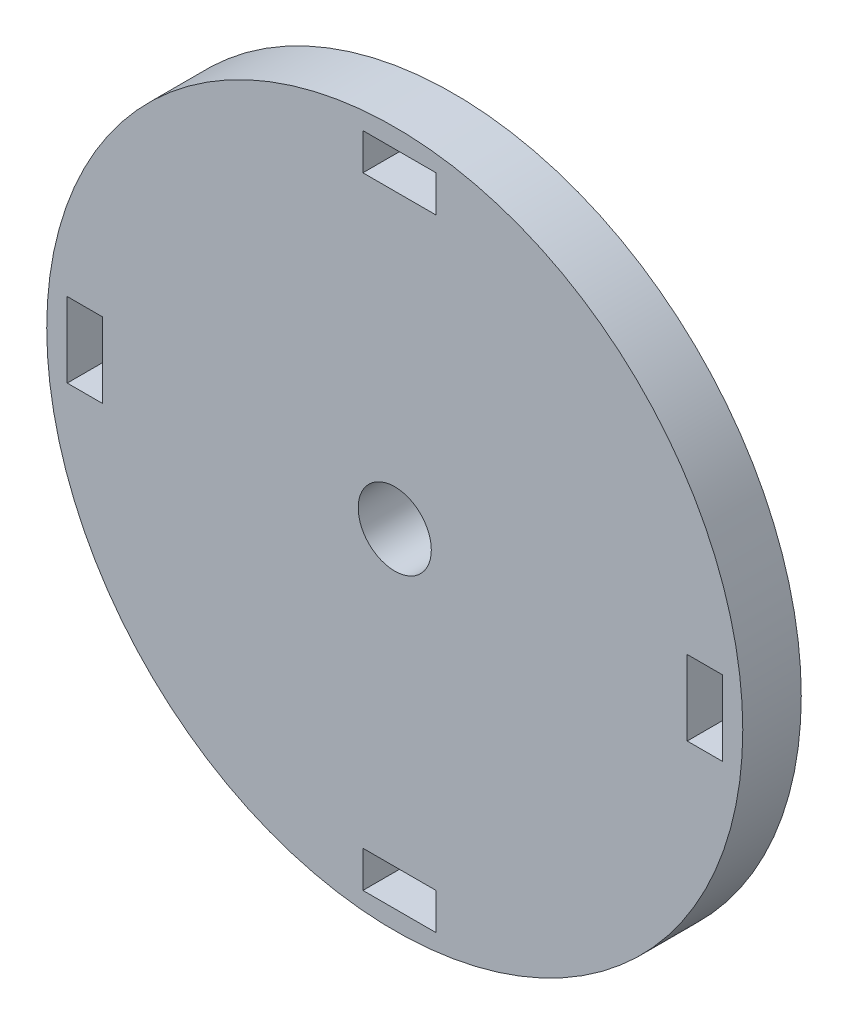
ISO-10303-21;
HEADER;
FILE_DESCRIPTION(('STEP AP214'),'2;1');
FILE_NAME('part.step','',(''),(''),'','','');
FILE_SCHEMA(('AUTOMOTIVE_DESIGN { 1 0 10303 214 1 1 1 1 }'));
ENDSEC;
DATA;
#1=APPLICATION_CONTEXT('core data for automotive mechanical design processes');
#2=APPLICATION_PROTOCOL_DEFINITION('international standard','automotive_design',2000,#1);
#3=PRODUCT_CONTEXT('',#1,'mechanical');
#4=PRODUCT('Part','Part','',(#3));
#5=PRODUCT_RELATED_PRODUCT_CATEGORY('part','',(#4));
#6=PRODUCT_DEFINITION_FORMATION('','',#4);
#7=PRODUCT_DEFINITION_CONTEXT('part definition',#1,'design');
#8=PRODUCT_DEFINITION('design','',#6,#7);
#9=PRODUCT_DEFINITION_SHAPE('','',#8);
#10=(LENGTH_UNIT() NAMED_UNIT(*) SI_UNIT(.MILLI.,.METRE.));
#11=(NAMED_UNIT(*) PLANE_ANGLE_UNIT() SI_UNIT($,.RADIAN.));
#12=(NAMED_UNIT(*) SI_UNIT($,.STERADIAN.) SOLID_ANGLE_UNIT());
#13=UNCERTAINTY_MEASURE_WITH_UNIT(LENGTH_MEASURE(1.E-05),#10,'distance_accuracy_value','');
#14=(GEOMETRIC_REPRESENTATION_CONTEXT(3) GLOBAL_UNCERTAINTY_ASSIGNED_CONTEXT((#13)) GLOBAL_UNIT_ASSIGNED_CONTEXT((#10,
#11,#12)) REPRESENTATION_CONTEXT('',''));
#15=CARTESIAN_POINT('',(0.,0.,0.));
#16=DIRECTION('',(0.,0.,1.));
#17=DIRECTION('',(1.,0.,0.));
#18=AXIS2_PLACEMENT_3D('',#15,#16,#17);
#19=CARTESIAN_POINT('',(0.,0.,2.));
#20=DIRECTION('',(0.,0.,-1.));
#21=DIRECTION('',(-1.,0.,0.));
#22=AXIS2_PLACEMENT_3D('',#19,#20,#21);
#23=CYLINDRICAL_SURFACE('',#22,11.9);
#24=CARTESIAN_POINT('',(0.,0.,2.));
#25=DIRECTION('',(0.,0.,1.));
#26=DIRECTION('',(1.,0.,0.));
#27=AXIS2_PLACEMENT_3D('',#24,#25,#26);
#28=CIRCLE('',#27,11.9);
#29=CARTESIAN_POINT('',(11.9,0.,2.));
#30=VERTEX_POINT('',#29);
#31=EDGE_CURVE('E11',#30,#30,#28,.T.);
#32=ORIENTED_EDGE('',*,*,#31,.F.);
#33=EDGE_LOOP('',(#32));
#34=FACE_BOUND('',#33,.T.);
#35=CARTESIAN_POINT('',(0.,0.,0.));
#36=DIRECTION('',(0.,0.,1.));
#37=DIRECTION('',(1.,0.,0.));
#38=AXIS2_PLACEMENT_3D('',#35,#36,#37);
#39=CIRCLE('',#38,11.9);
#40=CARTESIAN_POINT('',(11.9,0.,0.));
#41=VERTEX_POINT('',#40);
#42=EDGE_CURVE('E42',#41,#41,#39,.T.);
#43=ORIENTED_EDGE('',*,*,#42,.T.);
#44=EDGE_LOOP('',(#43));
#45=FACE_BOUND('',#44,.T.);
#46=ADVANCED_FACE('F39',(#34,#45),#23,.T.);
#47=CARTESIAN_POINT('',(0.,0.,2.));
#48=DIRECTION('',(0.,0.,1.));
#49=DIRECTION('',(1.,0.,0.));
#50=AXIS2_PLACEMENT_3D('',#47,#48,#49);
#51=PLANE('',#50);
#52=DIRECTION('',(0.,-1.,0.));
#53=VECTOR('',#52,1.);
#54=CARTESIAN_POINT('',(1.41141560235169,-10.,2.));
#55=LINE('',#54,#53);
#56=CARTESIAN_POINT('',(1.41141560235169,-10.,2.));
#57=VERTEX_POINT('',#56);
#58=CARTESIAN_POINT('',(1.41141560235169,-11.25,2.));
#59=VERTEX_POINT('',#58);
#60=EDGE_CURVE('E165',#57,#59,#55,.T.);
#61=ORIENTED_EDGE('',*,*,#60,.T.);
#62=DIRECTION('',(-1.,0.,0.));
#63=VECTOR('',#62,1.);
#64=CARTESIAN_POINT('',(-1.08858439764831,-11.25,2.));
#65=LINE('',#64,#63);
#66=CARTESIAN_POINT('',(-1.08858439764831,-11.25,2.));
#67=VERTEX_POINT('',#66);
#68=EDGE_CURVE('E151',#59,#67,#65,.T.);
#69=ORIENTED_EDGE('',*,*,#68,.T.);
#70=DIRECTION('',(0.,1.,0.));
#71=VECTOR('',#70,1.);
#72=CARTESIAN_POINT('',(-1.08858439764831,-10.,2.));
#73=LINE('',#72,#71);
#74=CARTESIAN_POINT('',(-1.08858439764831,-10.,2.));
#75=VERTEX_POINT('',#74);
#76=EDGE_CURVE('E182',#67,#75,#73,.T.);
#77=ORIENTED_EDGE('',*,*,#76,.T.);
#78=DIRECTION('',(1.,0.,0.));
#79=VECTOR('',#78,1.);
#80=CARTESIAN_POINT('',(-1.08858439764831,-10.,2.));
#81=LINE('',#80,#79);
#82=EDGE_CURVE('E175',#75,#57,#81,.T.);
#83=ORIENTED_EDGE('',*,*,#82,.T.);
#84=EDGE_LOOP('',(#61,#69,#77,#83));
#85=FACE_BOUND('',#84,.T.);
#86=DIRECTION('',(0.,1.,0.));
#87=VECTOR('',#86,1.);
#88=CARTESIAN_POINT('',(-1.08858439764831,10.,2.));
#89=LINE('',#88,#87);
#90=CARTESIAN_POINT('',(-1.08858439764831,10.,2.));
#91=VERTEX_POINT('',#90);
#92=CARTESIAN_POINT('',(-1.08858439764831,11.25,2.));
#93=VERTEX_POINT('',#92);
#94=EDGE_CURVE('E210',#91,#93,#89,.T.);
#95=ORIENTED_EDGE('',*,*,#94,.T.);
#96=DIRECTION('',(1.,0.,0.));
#97=VECTOR('',#96,1.);
#98=CARTESIAN_POINT('',(-1.08858439764831,11.25,2.));
#99=LINE('',#98,#97);
#100=CARTESIAN_POINT('',(1.41141560235169,11.25,2.));
#101=VERTEX_POINT('',#100);
#102=EDGE_CURVE('E232',#93,#101,#99,.T.);
#103=ORIENTED_EDGE('',*,*,#102,.T.);
#104=DIRECTION('',(0.,-1.,0.));
#105=VECTOR('',#104,1.);
#106=CARTESIAN_POINT('',(1.41141560235169,10.,2.));
#107=LINE('',#106,#105);
#108=CARTESIAN_POINT('',(1.41141560235169,10.,2.));
#109=VERTEX_POINT('',#108);
#110=EDGE_CURVE('E202',#101,#109,#107,.T.);
#111=ORIENTED_EDGE('',*,*,#110,.T.);
#112=DIRECTION('',(-1.,0.,0.));
#113=VECTOR('',#112,1.);
#114=CARTESIAN_POINT('',(-1.08858439764831,10.,2.));
#115=LINE('',#114,#113);
#116=EDGE_CURVE('E206',#109,#91,#115,.T.);
#117=ORIENTED_EDGE('',*,*,#116,.T.);
#118=EDGE_LOOP('',(#95,#103,#111,#117));
#119=FACE_BOUND('',#118,.T.);
#120=CARTESIAN_POINT('',(0.,0.,2.));
#121=DIRECTION('',(0.,0.,1.));
#122=DIRECTION('',(1.,0.,0.));
#123=AXIS2_PLACEMENT_3D('',#120,#121,#122);
#124=CIRCLE('',#123,1.25);
#125=CARTESIAN_POINT('',(1.25,0.,2.));
#126=VERTEX_POINT('',#125);
#127=EDGE_CURVE('E160',#126,#126,#124,.T.);
#128=ORIENTED_EDGE('',*,*,#127,.F.);
#129=EDGE_LOOP('',(#128));
#130=FACE_BOUND('',#129,.T.);
#131=DIRECTION('',(0.,1.,0.));
#132=VECTOR('',#131,1.);
#133=CARTESIAN_POINT('',(11.1985406210925,-1.28177260866835,2.));
#134=LINE('',#133,#132);
#135=CARTESIAN_POINT('',(11.1985406210925,-1.28177260866835,2.));
#136=VERTEX_POINT('',#135);
#137=CARTESIAN_POINT('',(11.1985406210925,1.28177260866835,2.));
#138=VERTEX_POINT('',#137);
#139=EDGE_CURVE('E264',#136,#138,#134,.T.);
#140=ORIENTED_EDGE('',*,*,#139,.F.);
#141=DIRECTION('',(1.,0.,0.));
#142=VECTOR('',#141,1.);
#143=CARTESIAN_POINT('',(10.,-1.28177260866835,2.));
#144=LINE('',#143,#142);
#145=CARTESIAN_POINT('',(10.,-1.28177260866835,2.));
#146=VERTEX_POINT('',#145);
#147=EDGE_CURVE('E275',#146,#136,#144,.T.);
#148=ORIENTED_EDGE('',*,*,#147,.F.);
#149=DIRECTION('',(0.,-1.,0.));
#150=VECTOR('',#149,1.);
#151=CARTESIAN_POINT('',(10.,-1.28177260866835,2.));
#152=LINE('',#151,#150);
#153=CARTESIAN_POINT('',(10.,1.28177260866835,2.));
#154=VERTEX_POINT('',#153);
#155=EDGE_CURVE('E271',#154,#146,#152,.T.);
#156=ORIENTED_EDGE('',*,*,#155,.F.);
#157=DIRECTION('',(-1.,0.,0.));
#158=VECTOR('',#157,1.);
#159=CARTESIAN_POINT('',(10.,1.28177260866835,2.));
#160=LINE('',#159,#158);
#161=EDGE_CURVE('E267',#138,#154,#160,.T.);
#162=ORIENTED_EDGE('',*,*,#161,.F.);
#163=EDGE_LOOP('',(#140,#148,#156,#162));
#164=FACE_BOUND('',#163,.T.);
#165=DIRECTION('',(0.,1.,0.));
#166=VECTOR('',#165,1.);
#167=CARTESIAN_POINT('',(-10.,-1.28177260866835,2.));
#168=LINE('',#167,#166);
#169=CARTESIAN_POINT('',(-10.,-1.28177260866835,2.));
#170=VERTEX_POINT('',#169);
#171=CARTESIAN_POINT('',(-10.,1.28177260866835,2.));
#172=VERTEX_POINT('',#171);
#173=EDGE_CURVE('E306',#170,#172,#168,.T.);
#174=ORIENTED_EDGE('',*,*,#173,.F.);
#175=DIRECTION('',(1.,0.,0.));
#176=VECTOR('',#175,1.);
#177=CARTESIAN_POINT('',(-10.,-1.28177260866835,2.));
#178=LINE('',#177,#176);
#179=CARTESIAN_POINT('',(-11.1985406210925,-1.28177260866835,2.));
#180=VERTEX_POINT('',#179);
#181=EDGE_CURVE('E317',#180,#170,#178,.T.);
#182=ORIENTED_EDGE('',*,*,#181,.F.);
#183=DIRECTION('',(0.,-1.,0.));
#184=VECTOR('',#183,1.);
#185=CARTESIAN_POINT('',(-11.1985406210925,-1.28177260866835,2.));
#186=LINE('',#185,#184);
#187=CARTESIAN_POINT('',(-11.1985406210925,1.28177260866835,2.));
#188=VERTEX_POINT('',#187);
#189=EDGE_CURVE('E313',#188,#180,#186,.T.);
#190=ORIENTED_EDGE('',*,*,#189,.F.);
#191=DIRECTION('',(-1.,0.,0.));
#192=VECTOR('',#191,1.);
#193=CARTESIAN_POINT('',(-10.,1.28177260866835,2.));
#194=LINE('',#193,#192);
#195=EDGE_CURVE('E309',#172,#188,#194,.T.);
#196=ORIENTED_EDGE('',*,*,#195,.F.);
#197=EDGE_LOOP('',(#174,#182,#190,#196));
#198=FACE_BOUND('',#197,.T.);
#199=ORIENTED_EDGE('',*,*,#31,.T.);
#200=EDGE_LOOP('',(#199));
#201=FACE_BOUND('',#200,.T.);
#202=ADVANCED_FACE('F173',(#85,#119,#130,#164,#198,#201),#51,.T.);
#203=CARTESIAN_POINT('',(0.,0.,0.));
#204=DIRECTION('',(0.,0.,1.));
#205=DIRECTION('',(1.,0.,0.));
#206=AXIS2_PLACEMENT_3D('',#203,#204,#205);
#207=PLANE('',#206);
#208=DIRECTION('',(-1.,0.,0.));
#209=VECTOR('',#208,1.);
#210=CARTESIAN_POINT('',(-1.08858439764831,-11.25,0.));
#211=LINE('',#210,#209);
#212=CARTESIAN_POINT('',(1.41141560235169,-11.25,0.));
#213=VERTEX_POINT('',#212);
#214=CARTESIAN_POINT('',(-1.08858439764831,-11.25,0.));
#215=VERTEX_POINT('',#214);
#216=EDGE_CURVE('E180',#213,#215,#211,.T.);
#217=ORIENTED_EDGE('',*,*,#216,.F.);
#218=DIRECTION('',(0.,-1.,0.));
#219=VECTOR('',#218,1.);
#220=CARTESIAN_POINT('',(1.41141560235169,-10.,0.));
#221=LINE('',#220,#219);
#222=CARTESIAN_POINT('',(1.41141560235169,-10.,0.));
#223=VERTEX_POINT('',#222);
#224=EDGE_CURVE('E168',#223,#213,#221,.T.);
#225=ORIENTED_EDGE('',*,*,#224,.F.);
#226=DIRECTION('',(1.,0.,0.));
#227=VECTOR('',#226,1.);
#228=CARTESIAN_POINT('',(-1.08858439764831,-10.,0.));
#229=LINE('',#228,#227);
#230=CARTESIAN_POINT('',(-1.08858439764831,-10.,0.));
#231=VERTEX_POINT('',#230);
#232=EDGE_CURVE('E170',#231,#223,#229,.T.);
#233=ORIENTED_EDGE('',*,*,#232,.F.);
#234=DIRECTION('',(0.,1.,0.));
#235=VECTOR('',#234,1.);
#236=CARTESIAN_POINT('',(-1.08858439764831,-10.,0.));
#237=LINE('',#236,#235);
#238=EDGE_CURVE('E188',#215,#231,#237,.T.);
#239=ORIENTED_EDGE('',*,*,#238,.F.);
#240=EDGE_LOOP('',(#217,#225,#233,#239));
#241=FACE_BOUND('',#240,.T.);
#242=DIRECTION('',(1.,0.,0.));
#243=VECTOR('',#242,1.);
#244=CARTESIAN_POINT('',(-1.08858439764831,11.25,0.));
#245=LINE('',#244,#243);
#246=CARTESIAN_POINT('',(-1.08858439764831,11.25,0.));
#247=VERTEX_POINT('',#246);
#248=CARTESIAN_POINT('',(1.41141560235169,11.25,0.));
#249=VERTEX_POINT('',#248);
#250=EDGE_CURVE('E217',#247,#249,#245,.T.);
#251=ORIENTED_EDGE('',*,*,#250,.F.);
#252=DIRECTION('',(0.,1.,0.));
#253=VECTOR('',#252,1.);
#254=CARTESIAN_POINT('',(-1.08858439764831,10.,0.));
#255=LINE('',#254,#253);
#256=CARTESIAN_POINT('',(-1.08858439764831,10.,0.));
#257=VERTEX_POINT('',#256);
#258=EDGE_CURVE('E214',#257,#247,#255,.T.);
#259=ORIENTED_EDGE('',*,*,#258,.F.);
#260=DIRECTION('',(-1.,0.,0.));
#261=VECTOR('',#260,1.);
#262=CARTESIAN_POINT('',(-1.08858439764831,10.,0.));
#263=LINE('',#262,#261);
#264=CARTESIAN_POINT('',(1.41141560235169,10.,0.));
#265=VERTEX_POINT('',#264);
#266=EDGE_CURVE('E224',#265,#257,#263,.T.);
#267=ORIENTED_EDGE('',*,*,#266,.F.);
#268=DIRECTION('',(0.,-1.,0.));
#269=VECTOR('',#268,1.);
#270=CARTESIAN_POINT('',(1.41141560235169,10.,0.));
#271=LINE('',#270,#269);
#272=EDGE_CURVE('E220',#249,#265,#271,.T.);
#273=ORIENTED_EDGE('',*,*,#272,.F.);
#274=EDGE_LOOP('',(#251,#259,#267,#273));
#275=FACE_BOUND('',#274,.T.);
#276=CARTESIAN_POINT('',(0.,0.,0.));
#277=DIRECTION('',(0.,0.,1.));
#278=DIRECTION('',(1.,0.,0.));
#279=AXIS2_PLACEMENT_3D('',#276,#277,#278);
#280=CIRCLE('',#279,1.25);
#281=CARTESIAN_POINT('',(1.25,0.,0.));
#282=VERTEX_POINT('',#281);
#283=EDGE_CURVE('E247',#282,#282,#280,.F.);
#284=ORIENTED_EDGE('',*,*,#283,.F.);
#285=EDGE_LOOP('',(#284));
#286=FACE_BOUND('',#285,.T.);
#287=DIRECTION('',(-1.,0.,0.));
#288=VECTOR('',#287,1.);
#289=CARTESIAN_POINT('',(10.,-1.28177260866835,0.));
#290=LINE('',#289,#288);
#291=CARTESIAN_POINT('',(11.1985406210925,-1.28177260866835,0.));
#292=VERTEX_POINT('',#291);
#293=CARTESIAN_POINT('',(10.,-1.28177260866835,0.));
#294=VERTEX_POINT('',#293);
#295=EDGE_CURVE('E255',#292,#294,#290,.T.);
#296=ORIENTED_EDGE('',*,*,#295,.F.);
#297=DIRECTION('',(0.,-1.,0.));
#298=VECTOR('',#297,1.);
#299=CARTESIAN_POINT('',(11.1985406210925,-1.28177260866835,0.));
#300=LINE('',#299,#298);
#301=CARTESIAN_POINT('',(11.1985406210925,1.28177260866835,0.));
#302=VERTEX_POINT('',#301);
#303=EDGE_CURVE('E260',#302,#292,#300,.T.);
#304=ORIENTED_EDGE('',*,*,#303,.F.);
#305=DIRECTION('',(1.,0.,0.));
#306=VECTOR('',#305,1.);
#307=CARTESIAN_POINT('',(10.,1.28177260866835,0.));
#308=LINE('',#307,#306);
#309=CARTESIAN_POINT('',(10.,1.28177260866835,0.));
#310=VERTEX_POINT('',#309);
#311=EDGE_CURVE('E283',#310,#302,#308,.T.);
#312=ORIENTED_EDGE('',*,*,#311,.F.);
#313=DIRECTION('',(0.,1.,0.));
#314=VECTOR('',#313,1.);
#315=CARTESIAN_POINT('',(10.,-1.28177260866835,0.));
#316=LINE('',#315,#314);
#317=EDGE_CURVE('E252',#294,#310,#316,.T.);
#318=ORIENTED_EDGE('',*,*,#317,.F.);
#319=EDGE_LOOP('',(#296,#304,#312,#318));
#320=FACE_BOUND('',#319,.T.);
#321=DIRECTION('',(-1.,0.,0.));
#322=VECTOR('',#321,1.);
#323=CARTESIAN_POINT('',(-10.,-1.28177260866835,0.));
#324=LINE('',#323,#322);
#325=CARTESIAN_POINT('',(-10.,-1.28177260866835,0.));
#326=VERTEX_POINT('',#325);
#327=CARTESIAN_POINT('',(-11.1985406210925,-1.28177260866835,0.));
#328=VERTEX_POINT('',#327);
#329=EDGE_CURVE('E298',#326,#328,#324,.T.);
#330=ORIENTED_EDGE('',*,*,#329,.F.);
#331=DIRECTION('',(0.,-1.,0.));
#332=VECTOR('',#331,1.);
#333=CARTESIAN_POINT('',(-10.,-1.28177260866835,0.));
#334=LINE('',#333,#332);
#335=CARTESIAN_POINT('',(-10.,1.28177260866835,0.));
#336=VERTEX_POINT('',#335);
#337=EDGE_CURVE('E302',#336,#326,#334,.T.);
#338=ORIENTED_EDGE('',*,*,#337,.F.);
#339=DIRECTION('',(1.,0.,0.));
#340=VECTOR('',#339,1.);
#341=CARTESIAN_POINT('',(-10.,1.28177260866835,0.));
#342=LINE('',#341,#340);
#343=CARTESIAN_POINT('',(-11.1985406210925,1.28177260866835,0.));
#344=VERTEX_POINT('',#343);
#345=EDGE_CURVE('E256',#344,#336,#342,.T.);
#346=ORIENTED_EDGE('',*,*,#345,.F.);
#347=DIRECTION('',(0.,1.,0.));
#348=VECTOR('',#347,1.);
#349=CARTESIAN_POINT('',(-11.1985406210925,-1.28177260866835,0.));
#350=LINE('',#349,#348);
#351=EDGE_CURVE('E251',#328,#344,#350,.T.);
#352=ORIENTED_EDGE('',*,*,#351,.F.);
#353=EDGE_LOOP('',(#330,#338,#346,#352));
#354=FACE_BOUND('',#353,.T.);
#355=ORIENTED_EDGE('',*,*,#42,.F.);
#356=EDGE_LOOP('',(#355));
#357=FACE_BOUND('',#356,.T.);
#358=ADVANCED_FACE('F345',(#241,#275,#286,#320,#354,#357),#207,.F.);
#359=CARTESIAN_POINT('',(-10.,-1.28177260866835,-0.00100000000000013));
#360=DIRECTION('',(1.,0.,0.));
#361=DIRECTION('',(0.,0.,-1.));
#362=AXIS2_PLACEMENT_3D('',#359,#360,#361);
#363=PLANE('',#362);
#364=ORIENTED_EDGE('',*,*,#337,.T.);
#365=DIRECTION('',(0.,0.,1.));
#366=VECTOR('',#365,1.);
#367=CARTESIAN_POINT('',(-10.,-1.28177260866835,-0.00100000000000013));
#368=LINE('',#367,#366);
#369=EDGE_CURVE('E322',#326,#170,#368,.T.);
#370=ORIENTED_EDGE('',*,*,#369,.T.);
#371=ORIENTED_EDGE('',*,*,#173,.T.);
#372=DIRECTION('',(0.,0.,1.));
#373=VECTOR('',#372,1.);
#374=CARTESIAN_POINT('',(-10.,1.28177260866835,-0.00100000000000013));
#375=LINE('',#374,#373);
#376=EDGE_CURVE('E321',#336,#172,#375,.T.);
#377=ORIENTED_EDGE('',*,*,#376,.F.);
#378=EDGE_LOOP('',(#364,#370,#371,#377));
#379=FACE_BOUND('',#378,.T.);
#380=ADVANCED_FACE('F348',(#379),#363,.F.);
#381=CARTESIAN_POINT('',(-10.,-1.28177260866835,-0.00100000000000013));
#382=DIRECTION('',(0.,-1.,0.));
#383=DIRECTION('',(0.,0.,-1.));
#384=AXIS2_PLACEMENT_3D('',#381,#382,#383);
#385=PLANE('',#384);
#386=ORIENTED_EDGE('',*,*,#329,.T.);
#387=DIRECTION('',(0.,0.,1.));
#388=VECTOR('',#387,1.);
#389=CARTESIAN_POINT('',(-11.1985406210925,-1.28177260866835,-0.00100000000000013));
#390=LINE('',#389,#388);
#391=EDGE_CURVE('E325',#328,#180,#390,.T.);
#392=ORIENTED_EDGE('',*,*,#391,.T.);
#393=ORIENTED_EDGE('',*,*,#181,.T.);
#394=ORIENTED_EDGE('',*,*,#369,.F.);
#395=EDGE_LOOP('',(#386,#392,#393,#394));
#396=FACE_BOUND('',#395,.T.);
#397=ADVANCED_FACE('F357',(#396),#385,.F.);
#398=CARTESIAN_POINT('',(-11.1985406210925,-1.28177260866835,-0.00100000000000013));
#399=DIRECTION('',(-1.,0.,0.));
#400=DIRECTION('',(0.,0.,1.));
#401=AXIS2_PLACEMENT_3D('',#398,#399,#400);
#402=PLANE('',#401);
#403=ORIENTED_EDGE('',*,*,#351,.T.);
#404=DIRECTION('',(0.,0.,1.));
#405=VECTOR('',#404,1.);
#406=CARTESIAN_POINT('',(-11.1985406210925,1.28177260866835,-0.00100000000000013));
#407=LINE('',#406,#405);
#408=EDGE_CURVE('E328',#344,#188,#407,.T.);
#409=ORIENTED_EDGE('',*,*,#408,.T.);
#410=ORIENTED_EDGE('',*,*,#189,.T.);
#411=ORIENTED_EDGE('',*,*,#391,.F.);
#412=EDGE_LOOP('',(#403,#409,#410,#411));
#413=FACE_BOUND('',#412,.T.);
#414=ADVANCED_FACE('F355',(#413),#402,.F.);
#415=CARTESIAN_POINT('',(-10.,1.28177260866835,-0.00100000000000013));
#416=DIRECTION('',(0.,1.,0.));
#417=DIRECTION('',(-1.,0.,0.));
#418=AXIS2_PLACEMENT_3D('',#415,#416,#417);
#419=PLANE('',#418);
#420=ORIENTED_EDGE('',*,*,#345,.T.);
#421=ORIENTED_EDGE('',*,*,#376,.T.);
#422=ORIENTED_EDGE('',*,*,#195,.T.);
#423=ORIENTED_EDGE('',*,*,#408,.F.);
#424=EDGE_LOOP('',(#420,#421,#422,#423));
#425=FACE_BOUND('',#424,.T.);
#426=ADVANCED_FACE('F340',(#425),#419,.F.);
#427=CARTESIAN_POINT('',(11.1985406210925,-1.28177260866835,-0.00100000000000013));
#428=DIRECTION('',(1.,0.,0.));
#429=DIRECTION('',(0.,0.,-1.));
#430=AXIS2_PLACEMENT_3D('',#427,#428,#429);
#431=PLANE('',#430);
#432=ORIENTED_EDGE('',*,*,#303,.T.);
#433=DIRECTION('',(0.,0.,1.));
#434=VECTOR('',#433,1.);
#435=CARTESIAN_POINT('',(11.1985406210925,-1.28177260866835,-0.00100000000000013));
#436=LINE('',#435,#434);
#437=EDGE_CURVE('E280',#292,#136,#436,.T.);
#438=ORIENTED_EDGE('',*,*,#437,.T.);
#439=ORIENTED_EDGE('',*,*,#139,.T.);
#440=DIRECTION('',(0.,0.,1.));
#441=VECTOR('',#440,1.);
#442=CARTESIAN_POINT('',(11.1985406210925,1.28177260866835,-0.00100000000000013));
#443=LINE('',#442,#441);
#444=EDGE_CURVE('E279',#302,#138,#443,.T.);
#445=ORIENTED_EDGE('',*,*,#444,.F.);
#446=EDGE_LOOP('',(#432,#438,#439,#445));
#447=FACE_BOUND('',#446,.T.);
#448=ADVANCED_FACE('F385',(#447),#431,.F.);
#449=CARTESIAN_POINT('',(10.,-1.28177260866835,-0.00100000000000013));
#450=DIRECTION('',(0.,-1.,0.));
#451=DIRECTION('',(0.,0.,-1.));
#452=AXIS2_PLACEMENT_3D('',#449,#450,#451);
#453=PLANE('',#452);
#454=ORIENTED_EDGE('',*,*,#295,.T.);
#455=DIRECTION('',(0.,0.,1.));
#456=VECTOR('',#455,1.);
#457=CARTESIAN_POINT('',(10.,-1.28177260866835,-0.00100000000000013));
#458=LINE('',#457,#456);
#459=EDGE_CURVE('E284',#294,#146,#458,.T.);
#460=ORIENTED_EDGE('',*,*,#459,.T.);
#461=ORIENTED_EDGE('',*,*,#147,.T.);
#462=ORIENTED_EDGE('',*,*,#437,.F.);
#463=EDGE_LOOP('',(#454,#460,#461,#462));
#464=FACE_BOUND('',#463,.T.);
#465=ADVANCED_FACE('F389',(#464),#453,.F.);
#466=CARTESIAN_POINT('',(10.,-1.28177260866835,-0.00100000000000013));
#467=DIRECTION('',(-1.,0.,0.));
#468=DIRECTION('',(0.,0.,1.));
#469=AXIS2_PLACEMENT_3D('',#466,#467,#468);
#470=PLANE('',#469);
#471=ORIENTED_EDGE('',*,*,#317,.T.);
#472=DIRECTION('',(0.,0.,1.));
#473=VECTOR('',#472,1.);
#474=CARTESIAN_POINT('',(10.,1.28177260866835,-0.00100000000000013));
#475=LINE('',#474,#473);
#476=EDGE_CURVE('E287',#310,#154,#475,.T.);
#477=ORIENTED_EDGE('',*,*,#476,.T.);
#478=ORIENTED_EDGE('',*,*,#155,.T.);
#479=ORIENTED_EDGE('',*,*,#459,.F.);
#480=EDGE_LOOP('',(#471,#477,#478,#479));
#481=FACE_BOUND('',#480,.T.);
#482=ADVANCED_FACE('F394',(#481),#470,.F.);
#483=CARTESIAN_POINT('',(10.,1.28177260866835,-0.00100000000000013));
#484=DIRECTION('',(0.,1.,0.));
#485=DIRECTION('',(-1.,0.,0.));
#486=AXIS2_PLACEMENT_3D('',#483,#484,#485);
#487=PLANE('',#486);
#488=ORIENTED_EDGE('',*,*,#311,.T.);
#489=ORIENTED_EDGE('',*,*,#444,.T.);
#490=ORIENTED_EDGE('',*,*,#161,.T.);
#491=ORIENTED_EDGE('',*,*,#476,.F.);
#492=EDGE_LOOP('',(#488,#489,#490,#491));
#493=FACE_BOUND('',#492,.T.);
#494=ADVANCED_FACE('F398',(#493),#487,.F.);
#495=CARTESIAN_POINT('',(0.,0.,-0.00100000000000013));
#496=DIRECTION('',(0.,0.,1.));
#497=DIRECTION('',(1.,0.,0.));
#498=AXIS2_PLACEMENT_3D('',#495,#496,#497);
#499=CYLINDRICAL_SURFACE('',#498,1.25);
#500=ORIENTED_EDGE('',*,*,#127,.T.);
#501=EDGE_LOOP('',(#500));
#502=FACE_BOUND('',#501,.T.);
#503=ORIENTED_EDGE('',*,*,#283,.T.);
#504=EDGE_LOOP('',(#503));
#505=FACE_BOUND('',#504,.T.);
#506=ADVANCED_FACE('F401',(#502,#505),#499,.F.);
#507=CARTESIAN_POINT('',(-1.08858439764831,10.,2.001));
#508=DIRECTION('',(-1.,0.,0.));
#509=DIRECTION('',(0.,-1.,0.));
#510=AXIS2_PLACEMENT_3D('',#507,#508,#509);
#511=PLANE('',#510);
#512=DIRECTION('',(0.,0.,-1.));
#513=VECTOR('',#512,1.);
#514=CARTESIAN_POINT('',(-1.08858439764831,10.,2.001));
#515=LINE('',#514,#513);
#516=EDGE_CURVE('E229',#91,#257,#515,.T.);
#517=ORIENTED_EDGE('',*,*,#516,.T.);
#518=ORIENTED_EDGE('',*,*,#258,.T.);
#519=DIRECTION('',(0.,0.,-1.));
#520=VECTOR('',#519,1.);
#521=CARTESIAN_POINT('',(-1.08858439764831,11.25,2.001));
#522=LINE('',#521,#520);
#523=EDGE_CURVE('E228',#93,#247,#522,.T.);
#524=ORIENTED_EDGE('',*,*,#523,.F.);
#525=ORIENTED_EDGE('',*,*,#94,.F.);
#526=EDGE_LOOP('',(#517,#518,#524,#525));
#527=FACE_BOUND('',#526,.T.);
#528=ADVANCED_FACE('F408',(#527),#511,.F.);
#529=CARTESIAN_POINT('',(-1.08858439764831,10.,2.001));
#530=DIRECTION('',(0.,-1.,0.));
#531=DIRECTION('',(0.,0.,-1.));
#532=AXIS2_PLACEMENT_3D('',#529,#530,#531);
#533=PLANE('',#532);
#534=DIRECTION('',(0.,0.,-1.));
#535=VECTOR('',#534,1.);
#536=CARTESIAN_POINT('',(1.41141560235169,10.,2.001));
#537=LINE('',#536,#535);
#538=EDGE_CURVE('E233',#109,#265,#537,.T.);
#539=ORIENTED_EDGE('',*,*,#538,.T.);
#540=ORIENTED_EDGE('',*,*,#266,.T.);
#541=ORIENTED_EDGE('',*,*,#516,.F.);
#542=ORIENTED_EDGE('',*,*,#116,.F.);
#543=EDGE_LOOP('',(#539,#540,#541,#542));
#544=FACE_BOUND('',#543,.T.);
#545=ADVANCED_FACE('F412',(#544),#533,.F.);
#546=CARTESIAN_POINT('',(1.41141560235169,10.,2.001));
#547=DIRECTION('',(1.,0.,0.));
#548=DIRECTION('',(0.,1.,0.));
#549=AXIS2_PLACEMENT_3D('',#546,#547,#548);
#550=PLANE('',#549);
#551=DIRECTION('',(0.,0.,-1.));
#552=VECTOR('',#551,1.);
#553=CARTESIAN_POINT('',(1.41141560235169,11.25,2.001));
#554=LINE('',#553,#552);
#555=EDGE_CURVE('E62',#101,#249,#554,.T.);
#556=ORIENTED_EDGE('',*,*,#555,.T.);
#557=ORIENTED_EDGE('',*,*,#272,.T.);
#558=ORIENTED_EDGE('',*,*,#538,.F.);
#559=ORIENTED_EDGE('',*,*,#110,.F.);
#560=EDGE_LOOP('',(#556,#557,#558,#559));
#561=FACE_BOUND('',#560,.T.);
#562=ADVANCED_FACE('F417',(#561),#550,.F.);
#563=CARTESIAN_POINT('',(-1.08858439764831,11.25,2.001));
#564=DIRECTION('',(0.,1.,0.));
#565=DIRECTION('',(0.,0.,1.));
#566=AXIS2_PLACEMENT_3D('',#563,#564,#565);
#567=PLANE('',#566);
#568=ORIENTED_EDGE('',*,*,#523,.T.);
#569=ORIENTED_EDGE('',*,*,#250,.T.);
#570=ORIENTED_EDGE('',*,*,#555,.F.);
#571=ORIENTED_EDGE('',*,*,#102,.F.);
#572=EDGE_LOOP('',(#568,#569,#570,#571));
#573=FACE_BOUND('',#572,.T.);
#574=ADVANCED_FACE('F414',(#573),#567,.F.);
#575=CARTESIAN_POINT('',(1.41141560235169,-10.,2.001));
#576=DIRECTION('',(1.,0.,0.));
#577=DIRECTION('',(0.,1.,0.));
#578=AXIS2_PLACEMENT_3D('',#575,#576,#577);
#579=PLANE('',#578);
#580=DIRECTION('',(0.,0.,-1.));
#581=VECTOR('',#580,1.);
#582=CARTESIAN_POINT('',(1.41141560235169,-10.,2.001));
#583=LINE('',#582,#581);
#584=EDGE_CURVE('E161',#57,#223,#583,.T.);
#585=ORIENTED_EDGE('',*,*,#584,.T.);
#586=ORIENTED_EDGE('',*,*,#224,.T.);
#587=DIRECTION('',(0.,0.,-1.));
#588=VECTOR('',#587,1.);
#589=CARTESIAN_POINT('',(1.41141560235169,-11.25,2.001));
#590=LINE('',#589,#588);
#591=EDGE_CURVE('E154',#59,#213,#590,.T.);
#592=ORIENTED_EDGE('',*,*,#591,.F.);
#593=ORIENTED_EDGE('',*,*,#60,.F.);
#594=EDGE_LOOP('',(#585,#586,#592,#593));
#595=FACE_BOUND('',#594,.T.);
#596=ADVANCED_FACE('F164',(#595),#579,.F.);
#597=CARTESIAN_POINT('',(-1.08858439764831,-10.,2.001));
#598=DIRECTION('',(0.,1.,0.));
#599=DIRECTION('',(0.,0.,1.));
#600=AXIS2_PLACEMENT_3D('',#597,#598,#599);
#601=PLANE('',#600);
#602=DIRECTION('',(0.,0.,-1.));
#603=VECTOR('',#602,1.);
#604=CARTESIAN_POINT('',(-1.08858439764831,-10.,2.001));
#605=LINE('',#604,#603);
#606=EDGE_CURVE('E197',#75,#231,#605,.T.);
#607=ORIENTED_EDGE('',*,*,#606,.T.);
#608=ORIENTED_EDGE('',*,*,#232,.T.);
#609=ORIENTED_EDGE('',*,*,#584,.F.);
#610=ORIENTED_EDGE('',*,*,#82,.F.);
#611=EDGE_LOOP('',(#607,#608,#609,#610));
#612=FACE_BOUND('',#611,.T.);
#613=ADVANCED_FACE('F426',(#612),#601,.F.);
#614=CARTESIAN_POINT('',(-1.08858439764831,-10.,2.001));
#615=DIRECTION('',(-1.,0.,0.));
#616=DIRECTION('',(0.,-1.,0.));
#617=AXIS2_PLACEMENT_3D('',#614,#615,#616);
#618=PLANE('',#617);
#619=DIRECTION('',(0.,0.,-1.));
#620=VECTOR('',#619,1.);
#621=CARTESIAN_POINT('',(-1.08858439764831,-11.25,2.001));
#622=LINE('',#621,#620);
#623=EDGE_CURVE('E54',#67,#215,#622,.T.);
#624=ORIENTED_EDGE('',*,*,#623,.T.);
#625=ORIENTED_EDGE('',*,*,#238,.T.);
#626=ORIENTED_EDGE('',*,*,#606,.F.);
#627=ORIENTED_EDGE('',*,*,#76,.F.);
#628=EDGE_LOOP('',(#624,#625,#626,#627));
#629=FACE_BOUND('',#628,.T.);
#630=ADVANCED_FACE('F429',(#629),#618,.F.);
#631=CARTESIAN_POINT('',(-1.08858439764831,-11.25,2.001));
#632=DIRECTION('',(0.,-1.,0.));
#633=DIRECTION('',(0.,0.,-1.));
#634=AXIS2_PLACEMENT_3D('',#631,#632,#633);
#635=PLANE('',#634);
#636=ORIENTED_EDGE('',*,*,#591,.T.);
#637=ORIENTED_EDGE('',*,*,#216,.T.);
#638=ORIENTED_EDGE('',*,*,#623,.F.);
#639=ORIENTED_EDGE('',*,*,#68,.F.);
#640=EDGE_LOOP('',(#636,#637,#638,#639));
#641=FACE_BOUND('',#640,.T.);
#642=ADVANCED_FACE('F153',(#641),#635,.F.);
#643=CLOSED_SHELL('',(#46,#202,#358,#380,#397,#414,#426,#448,#465,#482,#494,#506,#528,#545,#562,
#574,#596,#613,#630,#642));
#644=MANIFOLD_SOLID_BREP('B2',#643);
#645=ADVANCED_BREP_SHAPE_REPRESENTATION('',(#18,#644),#14);
#646=SHAPE_DEFINITION_REPRESENTATION(#9,#645);
ENDSEC;
END-ISO-10303-21;
